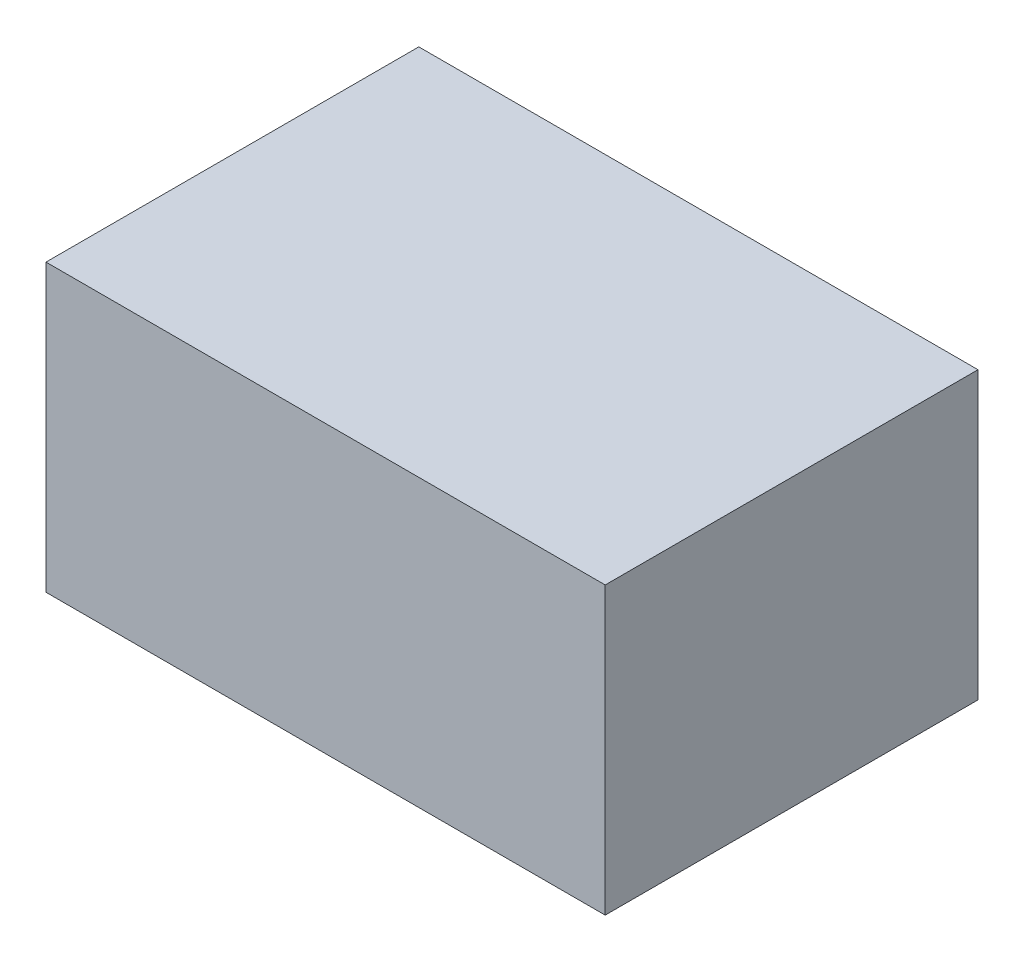
ISO-10303-21;
HEADER;
FILE_DESCRIPTION(('STEP AP214'),'2;1');
FILE_NAME('part.step','',(''),(''),'','','');
FILE_SCHEMA(('AUTOMOTIVE_DESIGN { 1 0 10303 214 1 1 1 1 }'));
ENDSEC;
DATA;
#1=APPLICATION_CONTEXT('core data for automotive mechanical design processes');
#2=APPLICATION_PROTOCOL_DEFINITION('international standard','automotive_design',2000,#1);
#3=PRODUCT_CONTEXT('',#1,'mechanical');
#4=PRODUCT('Part','Part','',(#3));
#5=PRODUCT_RELATED_PRODUCT_CATEGORY('part','',(#4));
#6=PRODUCT_DEFINITION_FORMATION('','',#4);
#7=PRODUCT_DEFINITION_CONTEXT('part definition',#1,'design');
#8=PRODUCT_DEFINITION('design','',#6,#7);
#9=PRODUCT_DEFINITION_SHAPE('','',#8);
#10=(LENGTH_UNIT() NAMED_UNIT(*) SI_UNIT(.MILLI.,.METRE.));
#11=(NAMED_UNIT(*) PLANE_ANGLE_UNIT() SI_UNIT($,.RADIAN.));
#12=(NAMED_UNIT(*) SI_UNIT($,.STERADIAN.) SOLID_ANGLE_UNIT());
#13=UNCERTAINTY_MEASURE_WITH_UNIT(LENGTH_MEASURE(1.E-05),#10,'distance_accuracy_value','');
#14=(GEOMETRIC_REPRESENTATION_CONTEXT(3) GLOBAL_UNCERTAINTY_ASSIGNED_CONTEXT((#13)) GLOBAL_UNIT_ASSIGNED_CONTEXT((#10,
#11,#12)) REPRESENTATION_CONTEXT('',''));
#15=CARTESIAN_POINT('',(0.,0.,0.));
#16=DIRECTION('',(0.,0.,1.));
#17=DIRECTION('',(1.,0.,0.));
#18=AXIS2_PLACEMENT_3D('',#15,#16,#17);
#19=CARTESIAN_POINT('',(-60.7727293370094,76.7079999999999,-130.495312043022));
#20=DIRECTION('',(-1.,0.,0.));
#21=DIRECTION('',(0.,0.,1.));
#22=AXIS2_PLACEMENT_3D('',#19,#20,#21);
#23=PLANE('',#22);
#24=DIRECTION('',(0.,0.,-1.));
#25=VECTOR('',#24,1.);
#26=CARTESIAN_POINT('',(-60.7727293370094,0.,-130.495312043022));
#27=LINE('',#26,#25);
#28=CARTESIAN_POINT('',(-60.7727293370094,0.,-30.4953120430222));
#29=VERTEX_POINT('',#28);
#30=CARTESIAN_POINT('',(-60.7727293370094,0.,-130.495312043022));
#31=VERTEX_POINT('',#30);
#32=EDGE_CURVE('E106',#29,#31,#27,.T.);
#33=ORIENTED_EDGE('',*,*,#32,.T.);
#34=DIRECTION('',(0.,-1.,0.));
#35=VECTOR('',#34,1.);
#36=CARTESIAN_POINT('',(-60.7727293370094,76.7079999999999,-130.495312043022));
#37=LINE('',#36,#35);
#38=CARTESIAN_POINT('',(-60.7727293370094,76.7079999999999,-130.495312043022));
#39=VERTEX_POINT('',#38);
#40=EDGE_CURVE('E11',#39,#31,#37,.T.);
#41=ORIENTED_EDGE('',*,*,#40,.F.);
#42=DIRECTION('',(0.,0.,-1.));
#43=VECTOR('',#42,1.);
#44=CARTESIAN_POINT('',(-60.7727293370094,76.7079999999999,-130.495312043022));
#45=LINE('',#44,#43);
#46=CARTESIAN_POINT('',(-60.7727293370094,76.7079999999999,-30.4953120430222));
#47=VERTEX_POINT('',#46);
#48=EDGE_CURVE('E94',#47,#39,#45,.T.);
#49=ORIENTED_EDGE('',*,*,#48,.F.);
#50=DIRECTION('',(0.,-1.,0.));
#51=VECTOR('',#50,1.);
#52=CARTESIAN_POINT('',(-60.7727293370094,76.7079999999999,-30.4953120430222));
#53=LINE('',#52,#51);
#54=EDGE_CURVE('E102',#47,#29,#53,.T.);
#55=ORIENTED_EDGE('',*,*,#54,.T.);
#56=EDGE_LOOP('',(#33,#41,#49,#55));
#57=FACE_BOUND('',#56,.T.);
#58=ADVANCED_FACE('F43',(#57),#23,.F.);
#59=CARTESIAN_POINT('',(-210.772729337009,76.7079999999999,-130.495312043022));
#60=DIRECTION('',(0.,0.,1.));
#61=DIRECTION('',(1.,0.,0.));
#62=AXIS2_PLACEMENT_3D('',#59,#60,#61);
#63=PLANE('',#62);
#64=DIRECTION('',(-1.,0.,0.));
#65=VECTOR('',#64,1.);
#66=CARTESIAN_POINT('',(-210.772729337009,0.,-130.495312043022));
#67=LINE('',#66,#65);
#68=CARTESIAN_POINT('',(-210.772729337009,0.,-130.495312043022));
#69=VERTEX_POINT('',#68);
#70=EDGE_CURVE('E98',#31,#69,#67,.T.);
#71=ORIENTED_EDGE('',*,*,#70,.T.);
#72=DIRECTION('',(0.,-1.,0.));
#73=VECTOR('',#72,1.);
#74=CARTESIAN_POINT('',(-210.772729337009,76.7079999999999,-130.495312043022));
#75=LINE('',#74,#73);
#76=CARTESIAN_POINT('',(-210.772729337009,76.7079999999999,-130.495312043022));
#77=VERTEX_POINT('',#76);
#78=EDGE_CURVE('E51',#77,#69,#75,.T.);
#79=ORIENTED_EDGE('',*,*,#78,.F.);
#80=DIRECTION('',(-1.,0.,0.));
#81=VECTOR('',#80,1.);
#82=CARTESIAN_POINT('',(-210.772729337009,76.7079999999999,-130.495312043022));
#83=LINE('',#82,#81);
#84=EDGE_CURVE('E89',#39,#77,#83,.T.);
#85=ORIENTED_EDGE('',*,*,#84,.F.);
#86=ORIENTED_EDGE('',*,*,#40,.T.);
#87=EDGE_LOOP('',(#71,#79,#85,#86));
#88=FACE_BOUND('',#87,.T.);
#89=ADVANCED_FACE('F97',(#88),#63,.F.);
#90=CARTESIAN_POINT('',(-210.772729337009,76.7079999999999,-130.495312043022));
#91=DIRECTION('',(1.,0.,0.));
#92=DIRECTION('',(0.,0.,-1.));
#93=AXIS2_PLACEMENT_3D('',#90,#91,#92);
#94=PLANE('',#93);
#95=DIRECTION('',(0.,0.,1.));
#96=VECTOR('',#95,1.);
#97=CARTESIAN_POINT('',(-210.772729337009,0.,-130.495312043022));
#98=LINE('',#97,#96);
#99=CARTESIAN_POINT('',(-210.772729337009,0.,-30.4953120430222));
#100=VERTEX_POINT('',#99);
#101=EDGE_CURVE('E76',#69,#100,#98,.T.);
#102=ORIENTED_EDGE('',*,*,#101,.T.);
#103=DIRECTION('',(0.,-1.,0.));
#104=VECTOR('',#103,1.);
#105=CARTESIAN_POINT('',(-210.772729337009,76.7079999999999,-30.4953120430222));
#106=LINE('',#105,#104);
#107=CARTESIAN_POINT('',(-210.772729337009,76.7079999999999,-30.4953120430222));
#108=VERTEX_POINT('',#107);
#109=EDGE_CURVE('E99',#108,#100,#106,.T.);
#110=ORIENTED_EDGE('',*,*,#109,.F.);
#111=DIRECTION('',(0.,0.,1.));
#112=VECTOR('',#111,1.);
#113=CARTESIAN_POINT('',(-210.772729337009,76.7079999999999,-130.495312043022));
#114=LINE('',#113,#112);
#115=EDGE_CURVE('E92',#77,#108,#114,.T.);
#116=ORIENTED_EDGE('',*,*,#115,.F.);
#117=ORIENTED_EDGE('',*,*,#78,.T.);
#118=EDGE_LOOP('',(#102,#110,#116,#117));
#119=FACE_BOUND('',#118,.T.);
#120=ADVANCED_FACE('F100',(#119),#94,.F.);
#121=CARTESIAN_POINT('',(-210.772729337009,76.7079999999999,-30.4953120430222));
#122=DIRECTION('',(0.,0.,-1.));
#123=DIRECTION('',(-1.,0.,0.));
#124=AXIS2_PLACEMENT_3D('',#121,#122,#123);
#125=PLANE('',#124);
#126=DIRECTION('',(1.,0.,0.));
#127=VECTOR('',#126,1.);
#128=CARTESIAN_POINT('',(-210.772729337009,0.,-30.4953120430222));
#129=LINE('',#128,#127);
#130=EDGE_CURVE('E82',#100,#29,#129,.T.);
#131=ORIENTED_EDGE('',*,*,#130,.T.);
#132=ORIENTED_EDGE('',*,*,#54,.F.);
#133=DIRECTION('',(1.,0.,0.));
#134=VECTOR('',#133,1.);
#135=CARTESIAN_POINT('',(-210.772729337009,76.7079999999999,-30.4953120430222));
#136=LINE('',#135,#134);
#137=EDGE_CURVE('E59',#108,#47,#136,.T.);
#138=ORIENTED_EDGE('',*,*,#137,.F.);
#139=ORIENTED_EDGE('',*,*,#109,.T.);
#140=EDGE_LOOP('',(#131,#132,#138,#139));
#141=FACE_BOUND('',#140,.T.);
#142=ADVANCED_FACE('F113',(#141),#125,.F.);
#143=CARTESIAN_POINT('',(0.,76.7079999999999,0.));
#144=DIRECTION('',(0.,1.,0.));
#145=DIRECTION('',(0.,0.,1.));
#146=AXIS2_PLACEMENT_3D('',#143,#144,#145);
#147=PLANE('',#146);
#148=ORIENTED_EDGE('',*,*,#48,.T.);
#149=ORIENTED_EDGE('',*,*,#84,.T.);
#150=ORIENTED_EDGE('',*,*,#115,.T.);
#151=ORIENTED_EDGE('',*,*,#137,.T.);
#152=EDGE_LOOP('',(#148,#149,#150,#151));
#153=FACE_BOUND('',#152,.T.);
#154=ADVANCED_FACE('F90',(#153),#147,.T.);
#155=CARTESIAN_POINT('',(0.,0.,0.));
#156=DIRECTION('',(0.,1.,0.));
#157=DIRECTION('',(0.,0.,1.));
#158=AXIS2_PLACEMENT_3D('',#155,#156,#157);
#159=PLANE('',#158);
#160=ORIENTED_EDGE('',*,*,#32,.F.);
#161=ORIENTED_EDGE('',*,*,#130,.F.);
#162=ORIENTED_EDGE('',*,*,#101,.F.);
#163=ORIENTED_EDGE('',*,*,#70,.F.);
#164=EDGE_LOOP('',(#160,#161,#162,#163));
#165=FACE_BOUND('',#164,.T.);
#166=ADVANCED_FACE('F116',(#165),#159,.F.);
#167=CLOSED_SHELL('',(#58,#89,#120,#142,#154,#166));
#168=MANIFOLD_SOLID_BREP('B2',#167);
#169=ADVANCED_BREP_SHAPE_REPRESENTATION('',(#18,#168),#14);
#170=SHAPE_DEFINITION_REPRESENTATION(#9,#169);
ENDSEC;
END-ISO-10303-21;
